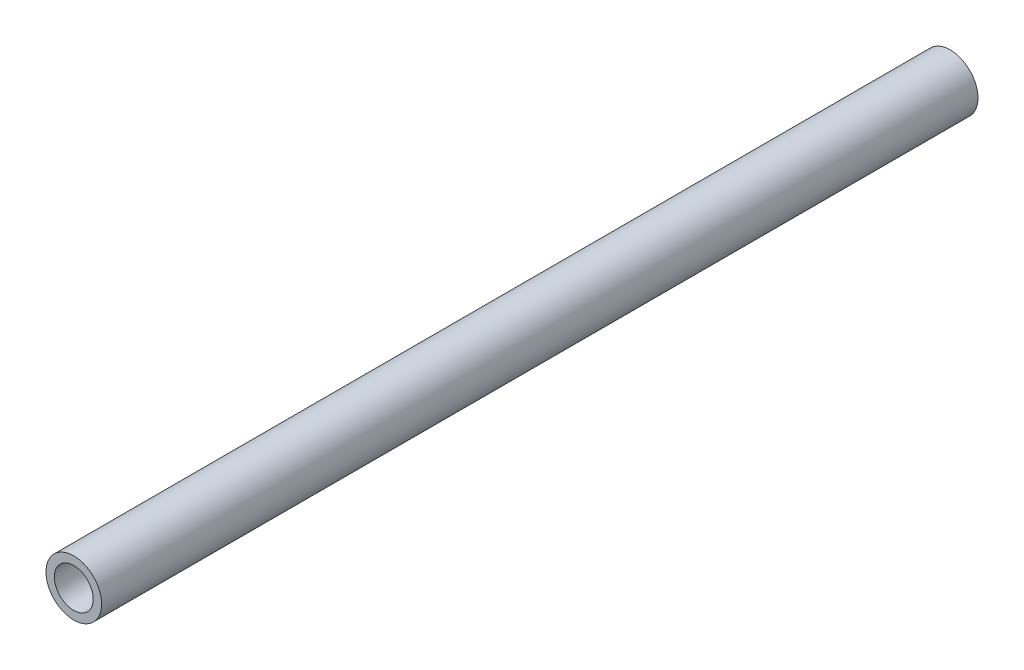
ISO-10303-21;
HEADER;
FILE_DESCRIPTION(('STEP AP214'),'2;1');
FILE_NAME('part.step','',(''),(''),'','','');
FILE_SCHEMA(('AUTOMOTIVE_DESIGN { 1 0 10303 214 1 1 1 1 }'));
ENDSEC;
DATA;
#1=APPLICATION_CONTEXT('core data for automotive mechanical design processes');
#2=APPLICATION_PROTOCOL_DEFINITION('international standard','automotive_design',2000,#1);
#3=PRODUCT_CONTEXT('',#1,'mechanical');
#4=PRODUCT('Part','Part','',(#3));
#5=PRODUCT_RELATED_PRODUCT_CATEGORY('part','',(#4));
#6=PRODUCT_DEFINITION_FORMATION('','',#4);
#7=PRODUCT_DEFINITION_CONTEXT('part definition',#1,'design');
#8=PRODUCT_DEFINITION('design','',#6,#7);
#9=PRODUCT_DEFINITION_SHAPE('','',#8);
#10=(LENGTH_UNIT() NAMED_UNIT(*) SI_UNIT(.MILLI.,.METRE.));
#11=(NAMED_UNIT(*) PLANE_ANGLE_UNIT() SI_UNIT($,.RADIAN.));
#12=(NAMED_UNIT(*) SI_UNIT($,.STERADIAN.) SOLID_ANGLE_UNIT());
#13=UNCERTAINTY_MEASURE_WITH_UNIT(LENGTH_MEASURE(1.E-05),#10,'distance_accuracy_value','');
#14=(GEOMETRIC_REPRESENTATION_CONTEXT(3) GLOBAL_UNCERTAINTY_ASSIGNED_CONTEXT((#13)) GLOBAL_UNIT_ASSIGNED_CONTEXT((#10,
#11,#12)) REPRESENTATION_CONTEXT('',''));
#15=CARTESIAN_POINT('',(0.,0.,0.));
#16=DIRECTION('',(0.,0.,1.));
#17=DIRECTION('',(1.,0.,0.));
#18=AXIS2_PLACEMENT_3D('',#15,#16,#17);
#19=CARTESIAN_POINT('',(0.,0.,500.));
#20=DIRECTION('',(0.,0.,1.));
#21=DIRECTION('',(1.,0.,0.));
#22=AXIS2_PLACEMENT_3D('',#19,#20,#21);
#23=PLANE('',#22);
#24=CARTESIAN_POINT('',(0.,0.,500.));
#25=DIRECTION('',(0.,0.,1.));
#26=DIRECTION('',(1.,0.,0.));
#27=AXIS2_PLACEMENT_3D('',#24,#25,#26);
#28=CIRCLE('',#27,15.875);
#29=CARTESIAN_POINT('',(15.875,0.,500.));
#30=VERTEX_POINT('',#29);
#31=EDGE_CURVE('E10',#30,#30,#28,.T.);
#32=ORIENTED_EDGE('',*,*,#31,.T.);
#33=EDGE_LOOP('',(#32));
#34=FACE_BOUND('',#33,.T.);
#35=CARTESIAN_POINT('',(0.,0.,500.));
#36=DIRECTION('',(0.,0.,1.));
#37=DIRECTION('',(1.,0.,0.));
#38=AXIS2_PLACEMENT_3D('',#35,#36,#37);
#39=CIRCLE('',#38,11.1);
#40=CARTESIAN_POINT('',(11.1,0.,500.));
#41=VERTEX_POINT('',#40);
#42=EDGE_CURVE('E48',#41,#41,#39,.T.);
#43=ORIENTED_EDGE('',*,*,#42,.F.);
#44=EDGE_LOOP('',(#43));
#45=FACE_BOUND('',#44,.T.);
#46=ADVANCED_FACE('F37',(#34,#45),#23,.T.);
#47=CARTESIAN_POINT('',(0.,0.,0.));
#48=DIRECTION('',(0.,0.,1.));
#49=DIRECTION('',(1.,0.,0.));
#50=AXIS2_PLACEMENT_3D('',#47,#48,#49);
#51=PLANE('',#50);
#52=CARTESIAN_POINT('',(0.,0.,0.));
#53=DIRECTION('',(0.,0.,1.));
#54=DIRECTION('',(1.,0.,0.));
#55=AXIS2_PLACEMENT_3D('',#52,#53,#54);
#56=CIRCLE('',#55,15.875);
#57=CARTESIAN_POINT('',(15.875,0.,0.));
#58=VERTEX_POINT('',#57);
#59=EDGE_CURVE('E41',#58,#58,#56,.T.);
#60=ORIENTED_EDGE('',*,*,#59,.F.);
#61=EDGE_LOOP('',(#60));
#62=FACE_BOUND('',#61,.T.);
#63=CARTESIAN_POINT('',(0.,0.,0.));
#64=DIRECTION('',(0.,0.,1.));
#65=DIRECTION('',(1.,0.,0.));
#66=AXIS2_PLACEMENT_3D('',#63,#64,#65);
#67=CIRCLE('',#66,11.1);
#68=CARTESIAN_POINT('',(11.1,0.,0.));
#69=VERTEX_POINT('',#68);
#70=EDGE_CURVE('E50',#69,#69,#67,.T.);
#71=ORIENTED_EDGE('',*,*,#70,.T.);
#72=EDGE_LOOP('',(#71));
#73=FACE_BOUND('',#72,.T.);
#74=ADVANCED_FACE('F60',(#62,#73),#51,.F.);
#75=CARTESIAN_POINT('',(0.,0.,500.));
#76=DIRECTION('',(0.,0.,-1.));
#77=DIRECTION('',(-1.,0.,0.));
#78=AXIS2_PLACEMENT_3D('',#75,#76,#77);
#79=CYLINDRICAL_SURFACE('',#78,15.875);
#80=ORIENTED_EDGE('',*,*,#31,.F.);
#81=EDGE_LOOP('',(#80));
#82=FACE_BOUND('',#81,.T.);
#83=ORIENTED_EDGE('',*,*,#59,.T.);
#84=EDGE_LOOP('',(#83));
#85=FACE_BOUND('',#84,.T.);
#86=ADVANCED_FACE('F39',(#82,#85),#79,.T.);
#87=CARTESIAN_POINT('',(0.,0.,500.));
#88=DIRECTION('',(0.,0.,-1.));
#89=DIRECTION('',(-1.,0.,0.));
#90=AXIS2_PLACEMENT_3D('',#87,#88,#89);
#91=CYLINDRICAL_SURFACE('',#90,11.1);
#92=ORIENTED_EDGE('',*,*,#42,.T.);
#93=EDGE_LOOP('',(#92));
#94=FACE_BOUND('',#93,.T.);
#95=ORIENTED_EDGE('',*,*,#70,.F.);
#96=EDGE_LOOP('',(#95));
#97=FACE_BOUND('',#96,.T.);
#98=ADVANCED_FACE('F56',(#94,#97),#91,.F.);
#99=CLOSED_SHELL('',(#46,#74,#86,#98));
#100=MANIFOLD_SOLID_BREP('B2',#99);
#101=ADVANCED_BREP_SHAPE_REPRESENTATION('',(#18,#100),#14);
#102=SHAPE_DEFINITION_REPRESENTATION(#9,#101);
ENDSEC;
END-ISO-10303-21;
